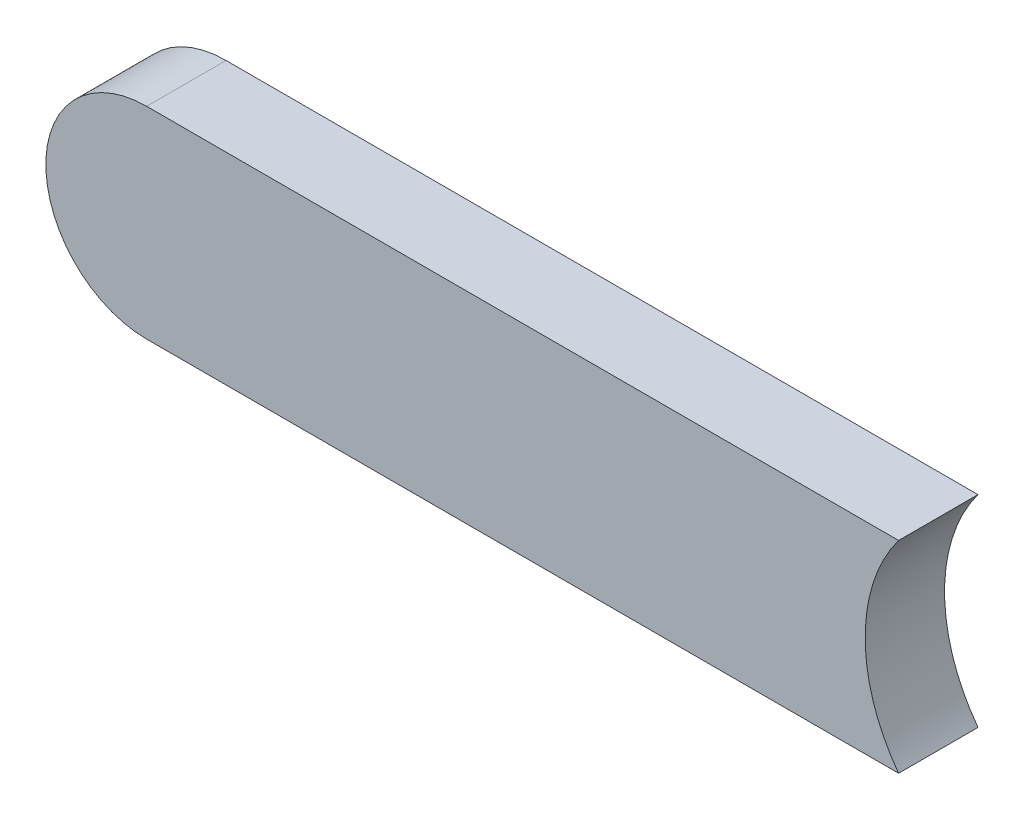
ISO-10303-21;
HEADER;
FILE_DESCRIPTION(('STEP AP214'),'2;1');
FILE_NAME('part.step','',(''),(''),'','','');
FILE_SCHEMA(('AUTOMOTIVE_DESIGN { 1 0 10303 214 1 1 1 1 }'));
ENDSEC;
DATA;
#1=APPLICATION_CONTEXT('core data for automotive mechanical design processes');
#2=APPLICATION_PROTOCOL_DEFINITION('international standard','automotive_design',2000,#1);
#3=PRODUCT_CONTEXT('',#1,'mechanical');
#4=PRODUCT('Part','Part','',(#3));
#5=PRODUCT_RELATED_PRODUCT_CATEGORY('part','',(#4));
#6=PRODUCT_DEFINITION_FORMATION('','',#4);
#7=PRODUCT_DEFINITION_CONTEXT('part definition',#1,'design');
#8=PRODUCT_DEFINITION('design','',#6,#7);
#9=PRODUCT_DEFINITION_SHAPE('','',#8);
#10=(LENGTH_UNIT() NAMED_UNIT(*) SI_UNIT(.MILLI.,.METRE.));
#11=(NAMED_UNIT(*) PLANE_ANGLE_UNIT() SI_UNIT($,.RADIAN.));
#12=(NAMED_UNIT(*) SI_UNIT($,.STERADIAN.) SOLID_ANGLE_UNIT());
#13=UNCERTAINTY_MEASURE_WITH_UNIT(LENGTH_MEASURE(1.E-05),#10,'distance_accuracy_value','');
#14=(GEOMETRIC_REPRESENTATION_CONTEXT(3) GLOBAL_UNCERTAINTY_ASSIGNED_CONTEXT((#13)) GLOBAL_UNIT_ASSIGNED_CONTEXT((#10,
#11,#12)) REPRESENTATION_CONTEXT('',''));
#15=CARTESIAN_POINT('',(0.,0.,0.));
#16=DIRECTION('',(0.,0.,1.));
#17=DIRECTION('',(1.,0.,0.));
#18=AXIS2_PLACEMENT_3D('',#15,#16,#17);
#19=CARTESIAN_POINT('',(148.1328,108.966,0.));
#20=DIRECTION('',(0.,1.,0.));
#21=DIRECTION('',(1.,0.,0.));
#22=AXIS2_PLACEMENT_3D('',#19,#20,#21);
#23=PLANE('',#22);
#24=DIRECTION('',(1.,0.,0.));
#25=VECTOR('',#24,1.);
#26=CARTESIAN_POINT('',(148.1328,108.966,0.1999996));
#27=LINE('',#26,#25);
#28=CARTESIAN_POINT('',(148.1328,108.966,0.1999996));
#29=VERTEX_POINT('',#28);
#30=CARTESIAN_POINT('',(150.027251768896,108.966,0.1999996));
#31=VERTEX_POINT('',#30);
#32=EDGE_CURVE('E11',#29,#31,#27,.T.);
#33=ORIENTED_EDGE('',*,*,#32,.F.);
#34=DIRECTION('',(0.,0.,1.));
#35=VECTOR('',#34,1.);
#36=CARTESIAN_POINT('',(148.1328,108.966,0.));
#37=LINE('',#36,#35);
#38=CARTESIAN_POINT('',(148.1328,108.966,0.));
#39=VERTEX_POINT('',#38);
#40=EDGE_CURVE('E24',#39,#29,#37,.T.);
#41=ORIENTED_EDGE('',*,*,#40,.F.);
#42=DIRECTION('',(1.,0.,0.));
#43=VECTOR('',#42,1.);
#44=CARTESIAN_POINT('',(148.1328,108.966,0.));
#45=LINE('',#44,#43);
#46=CARTESIAN_POINT('',(150.027251768896,108.966,0.));
#47=VERTEX_POINT('',#46);
#48=EDGE_CURVE('E75',#39,#47,#45,.T.);
#49=ORIENTED_EDGE('',*,*,#48,.T.);
#50=DIRECTION('',(0.,0.,1.));
#51=VECTOR('',#50,1.);
#52=CARTESIAN_POINT('',(150.027251768896,108.966,0.));
#53=LINE('',#52,#51);
#54=EDGE_CURVE('E37',#47,#31,#53,.T.);
#55=ORIENTED_EDGE('',*,*,#54,.T.);
#56=EDGE_LOOP('',(#33,#41,#49,#55));
#57=FACE_BOUND('',#56,.T.);
#58=ADVANCED_FACE('F17',(#57),#23,.F.);
#59=CARTESIAN_POINT('',(150.368,109.22,0.));
#60=DIRECTION('',(0.,0.,-1.));
#61=DIRECTION('',(1.,0.,0.));
#62=AXIS2_PLACEMENT_3D('',#59,#60,#61);
#63=CYLINDRICAL_SURFACE('',#62,0.42500042);
#64=DIRECTION('',(0.,0.,1.));
#65=VECTOR('',#64,1.);
#66=CARTESIAN_POINT('',(150.027251768896,109.474,0.));
#67=LINE('',#66,#65);
#68=CARTESIAN_POINT('',(150.027251768896,109.474,0.));
#69=VERTEX_POINT('',#68);
#70=CARTESIAN_POINT('',(150.027251768896,109.474,0.1999996));
#71=VERTEX_POINT('',#70);
#72=EDGE_CURVE('E67',#69,#71,#67,.T.);
#73=ORIENTED_EDGE('',*,*,#72,.T.);
#74=CARTESIAN_POINT('',(150.368,109.22,0.1999996));
#75=DIRECTION('',(0.,0.,1.));
#76=DIRECTION('',(1.,0.,0.));
#77=AXIS2_PLACEMENT_3D('',#74,#75,#76);
#78=CIRCLE('',#77,0.42500042);
#79=EDGE_CURVE('E82',#71,#31,#78,.T.);
#80=ORIENTED_EDGE('',*,*,#79,.T.);
#81=ORIENTED_EDGE('',*,*,#54,.F.);
#82=CARTESIAN_POINT('',(150.368,109.22,0.));
#83=DIRECTION('',(0.,0.,1.));
#84=DIRECTION('',(1.,0.,0.));
#85=AXIS2_PLACEMENT_3D('',#82,#83,#84);
#86=CIRCLE('',#85,0.42500042);
#87=EDGE_CURVE('E80',#69,#47,#86,.T.);
#88=ORIENTED_EDGE('',*,*,#87,.F.);
#89=EDGE_LOOP('',(#73,#80,#81,#88));
#90=FACE_BOUND('',#89,.T.);
#91=ADVANCED_FACE('F88',(#90),#63,.F.);
#92=CARTESIAN_POINT('',(150.027251768896,109.474,0.));
#93=DIRECTION('',(0.,-1.,0.));
#94=DIRECTION('',(-1.,0.,0.));
#95=AXIS2_PLACEMENT_3D('',#92,#93,#94);
#96=PLANE('',#95);
#97=DIRECTION('',(-1.,0.,0.));
#98=VECTOR('',#97,1.);
#99=CARTESIAN_POINT('',(150.368,109.474,0.1999996));
#100=LINE('',#99,#98);
#101=CARTESIAN_POINT('',(148.1328,109.474,0.1999996));
#102=VERTEX_POINT('',#101);
#103=EDGE_CURVE('E71',#71,#102,#100,.T.);
#104=ORIENTED_EDGE('',*,*,#103,.F.);
#105=ORIENTED_EDGE('',*,*,#72,.F.);
#106=DIRECTION('',(-1.,0.,0.));
#107=VECTOR('',#106,1.);
#108=CARTESIAN_POINT('',(150.368,109.474,0.));
#109=LINE('',#108,#107);
#110=CARTESIAN_POINT('',(148.1328,109.474,0.));
#111=VERTEX_POINT('',#110);
#112=EDGE_CURVE('E63',#69,#111,#109,.T.);
#113=ORIENTED_EDGE('',*,*,#112,.T.);
#114=DIRECTION('',(0.,0.,1.));
#115=VECTOR('',#114,1.);
#116=CARTESIAN_POINT('',(148.1328,109.474,0.));
#117=LINE('',#116,#115);
#118=EDGE_CURVE('E53',#111,#102,#117,.T.);
#119=ORIENTED_EDGE('',*,*,#118,.T.);
#120=EDGE_LOOP('',(#104,#105,#113,#119));
#121=FACE_BOUND('',#120,.T.);
#122=ADVANCED_FACE('F66',(#121),#96,.F.);
#123=CARTESIAN_POINT('',(148.1328,109.22,0.));
#124=DIRECTION('',(0.,0.,-1.));
#125=DIRECTION('',(-1.11896493820486E-13,1.,0.));
#126=AXIS2_PLACEMENT_3D('',#123,#124,#125);
#127=CYLINDRICAL_SURFACE('',#126,0.25400000000001);
#128=CARTESIAN_POINT('',(148.1328,109.22,0.1999996));
#129=DIRECTION('',(0.,0.,1.));
#130=DIRECTION('',(-1.11896493820486E-13,1.,0.));
#131=AXIS2_PLACEMENT_3D('',#128,#129,#130);
#132=CIRCLE('',#131,0.25400000000001);
#133=EDGE_CURVE('E59',#102,#29,#132,.T.);
#134=ORIENTED_EDGE('',*,*,#133,.F.);
#135=ORIENTED_EDGE('',*,*,#118,.F.);
#136=CARTESIAN_POINT('',(148.1328,109.22,0.));
#137=DIRECTION('',(0.,0.,1.));
#138=DIRECTION('',(-1.11896493820486E-13,1.,0.));
#139=AXIS2_PLACEMENT_3D('',#136,#137,#138);
#140=CIRCLE('',#139,0.25400000000001);
#141=EDGE_CURVE('E57',#111,#39,#140,.T.);
#142=ORIENTED_EDGE('',*,*,#141,.T.);
#143=ORIENTED_EDGE('',*,*,#40,.T.);
#144=EDGE_LOOP('',(#134,#135,#142,#143));
#145=FACE_BOUND('',#144,.T.);
#146=ADVANCED_FACE('F55',(#145),#127,.T.);
#147=CARTESIAN_POINT('',(148.1328,108.966,0.));
#148=DIRECTION('',(0.,0.,-1.));
#149=DIRECTION('',(-1.,0.,0.));
#150=AXIS2_PLACEMENT_3D('',#147,#148,#149);
#151=PLANE('',#150);
#152=ORIENTED_EDGE('',*,*,#48,.F.);
#153=ORIENTED_EDGE('',*,*,#141,.F.);
#154=ORIENTED_EDGE('',*,*,#112,.F.);
#155=ORIENTED_EDGE('',*,*,#87,.T.);
#156=EDGE_LOOP('',(#152,#153,#154,#155));
#157=FACE_BOUND('',#156,.T.);
#158=ADVANCED_FACE('F74',(#157),#151,.T.);
#159=CARTESIAN_POINT('',(148.1328,108.966,0.1999996));
#160=DIRECTION('',(0.,0.,-1.));
#161=DIRECTION('',(-1.,0.,0.));
#162=AXIS2_PLACEMENT_3D('',#159,#160,#161);
#163=PLANE('',#162);
#164=ORIENTED_EDGE('',*,*,#133,.T.);
#165=ORIENTED_EDGE('',*,*,#32,.T.);
#166=ORIENTED_EDGE('',*,*,#79,.F.);
#167=ORIENTED_EDGE('',*,*,#103,.T.);
#168=EDGE_LOOP('',(#164,#165,#166,#167));
#169=FACE_BOUND('',#168,.T.);
#170=ADVANCED_FACE('F91',(#169),#163,.F.);
#171=CLOSED_SHELL('',(#58,#91,#122,#146,#158,#170));
#172=MANIFOLD_SOLID_BREP('B1',#171);
#173=ADVANCED_BREP_SHAPE_REPRESENTATION('',(#18,#172),#14);
#174=SHAPE_DEFINITION_REPRESENTATION(#9,#173);
ENDSEC;
END-ISO-10303-21;
